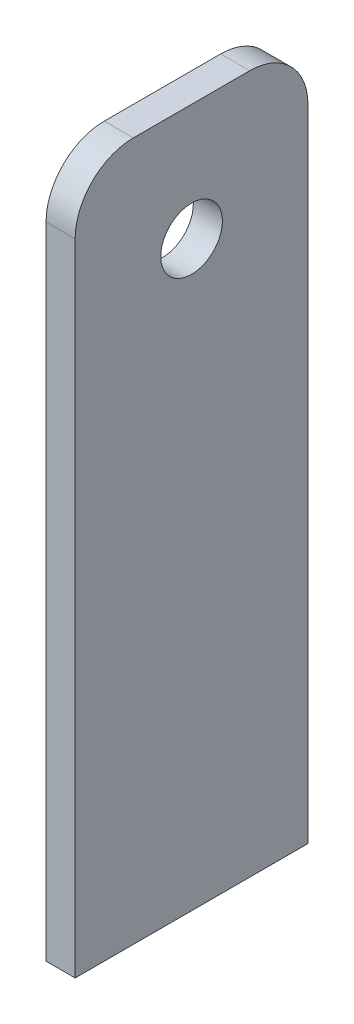
ISO-10303-21;
HEADER;
FILE_DESCRIPTION(('STEP AP214'),'2;1');
FILE_NAME('part.step','',(''),(''),'','','');
FILE_SCHEMA(('AUTOMOTIVE_DESIGN { 1 0 10303 214 1 1 1 1 }'));
ENDSEC;
DATA;
#1=APPLICATION_CONTEXT('core data for automotive mechanical design processes');
#2=APPLICATION_PROTOCOL_DEFINITION('international standard','automotive_design',2000,#1);
#3=PRODUCT_CONTEXT('',#1,'mechanical');
#4=PRODUCT('Part','Part','',(#3));
#5=PRODUCT_RELATED_PRODUCT_CATEGORY('part','',(#4));
#6=PRODUCT_DEFINITION_FORMATION('','',#4);
#7=PRODUCT_DEFINITION_CONTEXT('part definition',#1,'design');
#8=PRODUCT_DEFINITION('design','',#6,#7);
#9=PRODUCT_DEFINITION_SHAPE('','',#8);
#10=(LENGTH_UNIT() NAMED_UNIT(*) SI_UNIT(.MILLI.,.METRE.));
#11=(NAMED_UNIT(*) PLANE_ANGLE_UNIT() SI_UNIT($,.RADIAN.));
#12=(NAMED_UNIT(*) SI_UNIT($,.STERADIAN.) SOLID_ANGLE_UNIT());
#13=UNCERTAINTY_MEASURE_WITH_UNIT(LENGTH_MEASURE(1.E-05),#10,'distance_accuracy_value','');
#14=(GEOMETRIC_REPRESENTATION_CONTEXT(3) GLOBAL_UNCERTAINTY_ASSIGNED_CONTEXT((#13)) GLOBAL_UNIT_ASSIGNED_CONTEXT((#10,
#11,#12)) REPRESENTATION_CONTEXT('',''));
#15=CARTESIAN_POINT('',(0.,0.,0.));
#16=DIRECTION('',(0.,0.,1.));
#17=DIRECTION('',(1.,0.,0.));
#18=AXIS2_PLACEMENT_3D('',#15,#16,#17);
#19=CARTESIAN_POINT('',(0.,0.,0.));
#20=DIRECTION('',(1.,0.,0.));
#21=DIRECTION('',(0.,0.,-1.));
#22=AXIS2_PLACEMENT_3D('',#19,#20,#21);
#23=PLANE('',#22);
#24=CARTESIAN_POINT('',(0.,63.5,12.7));
#25=DIRECTION('',(1.,0.,0.));
#26=DIRECTION('',(0.,0.,-1.));
#27=AXIS2_PLACEMENT_3D('',#24,#25,#26);
#28=CIRCLE('',#27,3.3655);
#29=CARTESIAN_POINT('',(0.,63.5,9.3345));
#30=VERTEX_POINT('',#29);
#31=EDGE_CURVE('E85',#30,#30,#28,.T.);
#32=ORIENTED_EDGE('',*,*,#31,.T.);
#33=EDGE_LOOP('',(#32));
#34=FACE_BOUND('',#33,.T.);
#35=DIRECTION('',(0.,1.,0.));
#36=VECTOR('',#35,1.);
#37=CARTESIAN_POINT('',(0.,0.,0.));
#38=LINE('',#37,#36);
#39=CARTESIAN_POINT('',(0.,0.,0.));
#40=VERTEX_POINT('',#39);
#41=CARTESIAN_POINT('',(0.,69.85,0.));
#42=VERTEX_POINT('',#41);
#43=EDGE_CURVE('E69',#40,#42,#38,.T.);
#44=ORIENTED_EDGE('',*,*,#43,.F.);
#45=DIRECTION('',(0.,0.,-1.));
#46=VECTOR('',#45,1.);
#47=CARTESIAN_POINT('',(0.,0.,25.4));
#48=LINE('',#47,#46);
#49=CARTESIAN_POINT('',(0.,0.,25.4));
#50=VERTEX_POINT('',#49);
#51=EDGE_CURVE('E95',#50,#40,#48,.T.);
#52=ORIENTED_EDGE('',*,*,#51,.F.);
#53=DIRECTION('',(0.,1.,0.));
#54=VECTOR('',#53,1.);
#55=CARTESIAN_POINT('',(0.,76.2,25.4));
#56=LINE('',#55,#54);
#57=CARTESIAN_POINT('',(0.,69.85,25.4));
#58=VERTEX_POINT('',#57);
#59=EDGE_CURVE('E97',#58,#50,#56,.F.);
#60=ORIENTED_EDGE('',*,*,#59,.F.);
#61=CARTESIAN_POINT('',(0.,69.85,19.05));
#62=DIRECTION('',(-1.,0.,0.));
#63=DIRECTION('',(0.,0.,1.));
#64=AXIS2_PLACEMENT_3D('',#61,#62,#63);
#65=CIRCLE('',#64,6.35);
#66=CARTESIAN_POINT('',(0.,76.2,19.05));
#67=VERTEX_POINT('',#66);
#68=EDGE_CURVE('E105',#67,#58,#65,.F.);
#69=ORIENTED_EDGE('',*,*,#68,.F.);
#70=DIRECTION('',(0.,0.,1.));
#71=VECTOR('',#70,1.);
#72=CARTESIAN_POINT('',(0.,76.2,0.));
#73=LINE('',#72,#71);
#74=CARTESIAN_POINT('',(0.,76.2,6.35));
#75=VERTEX_POINT('',#74);
#76=EDGE_CURVE('E71',#75,#67,#73,.T.);
#77=ORIENTED_EDGE('',*,*,#76,.F.);
#78=CARTESIAN_POINT('',(0.,69.85,6.35));
#79=DIRECTION('',(-1.,0.,0.));
#80=DIRECTION('',(0.,0.,1.));
#81=AXIS2_PLACEMENT_3D('',#78,#79,#80);
#82=CIRCLE('',#81,6.35);
#83=EDGE_CURVE('E19',#42,#75,#82,.F.);
#84=ORIENTED_EDGE('',*,*,#83,.F.);
#85=EDGE_LOOP('',(#44,#52,#60,#69,#77,#84));
#86=FACE_BOUND('',#85,.T.);
#87=ADVANCED_FACE('F16',(#34,#86),#23,.F.);
#88=CARTESIAN_POINT('',(11.13155,69.85,6.35));
#89=DIRECTION('',(-1.,0.,0.));
#90=DIRECTION('',(0.,0.,1.));
#91=AXIS2_PLACEMENT_3D('',#88,#89,#90);
#92=CYLINDRICAL_SURFACE('',#91,6.35);
#93=CARTESIAN_POINT('',(3.175,69.85,6.35));
#94=DIRECTION('',(-1.,0.,0.));
#95=DIRECTION('',(0.,0.,1.));
#96=AXIS2_PLACEMENT_3D('',#93,#94,#95);
#97=CIRCLE('',#96,6.35);
#98=CARTESIAN_POINT('',(3.175,69.85,0.));
#99=VERTEX_POINT('',#98);
#100=CARTESIAN_POINT('',(3.175,76.2,6.35));
#101=VERTEX_POINT('',#100);
#102=EDGE_CURVE('E79',#99,#101,#97,.F.);
#103=ORIENTED_EDGE('',*,*,#102,.F.);
#104=DIRECTION('',(-1.,0.,0.));
#105=VECTOR('',#104,1.);
#106=CARTESIAN_POINT('',(0.,69.85,0.));
#107=LINE('',#106,#105);
#108=EDGE_CURVE('E76',#42,#99,#107,.F.);
#109=ORIENTED_EDGE('',*,*,#108,.F.);
#110=ORIENTED_EDGE('',*,*,#83,.T.);
#111=DIRECTION('',(1.,0.,0.));
#112=VECTOR('',#111,1.);
#113=CARTESIAN_POINT('',(0.,76.2,6.35));
#114=LINE('',#113,#112);
#115=EDGE_CURVE('E74',#101,#75,#114,.F.);
#116=ORIENTED_EDGE('',*,*,#115,.F.);
#117=EDGE_LOOP('',(#103,#109,#110,#116));
#118=FACE_BOUND('',#117,.T.);
#119=ADVANCED_FACE('F77',(#118),#92,.T.);
#120=CARTESIAN_POINT('',(0.,76.2,0.));
#121=DIRECTION('',(0.,1.,0.));
#122=DIRECTION('',(0.,0.,1.));
#123=AXIS2_PLACEMENT_3D('',#120,#121,#122);
#124=PLANE('',#123);
#125=DIRECTION('',(-1.,0.,0.));
#126=VECTOR('',#125,1.);
#127=CARTESIAN_POINT('',(11.13155,76.2,19.05));
#128=LINE('',#127,#126);
#129=CARTESIAN_POINT('',(3.175,76.2,19.05));
#130=VERTEX_POINT('',#129);
#131=EDGE_CURVE('E112',#130,#67,#128,.T.);
#132=ORIENTED_EDGE('',*,*,#131,.F.);
#133=DIRECTION('',(0.,0.,-1.));
#134=VECTOR('',#133,1.);
#135=CARTESIAN_POINT('',(3.175,76.2,0.));
#136=LINE('',#135,#134);
#137=EDGE_CURVE('E111',#101,#130,#136,.F.);
#138=ORIENTED_EDGE('',*,*,#137,.F.);
#139=ORIENTED_EDGE('',*,*,#115,.T.);
#140=ORIENTED_EDGE('',*,*,#76,.T.);
#141=EDGE_LOOP('',(#132,#138,#139,#140));
#142=FACE_BOUND('',#141,.T.);
#143=ADVANCED_FACE('F146',(#142),#124,.T.);
#144=CARTESIAN_POINT('',(11.13155,69.85,19.05));
#145=DIRECTION('',(-1.,0.,0.));
#146=DIRECTION('',(0.,0.,1.));
#147=AXIS2_PLACEMENT_3D('',#144,#145,#146);
#148=CYLINDRICAL_SURFACE('',#147,6.35);
#149=CARTESIAN_POINT('',(3.175,69.85,19.05));
#150=DIRECTION('',(-1.,0.,0.));
#151=DIRECTION('',(0.,0.,1.));
#152=AXIS2_PLACEMENT_3D('',#149,#150,#151);
#153=CIRCLE('',#152,6.35);
#154=CARTESIAN_POINT('',(3.175,69.85,25.4));
#155=VERTEX_POINT('',#154);
#156=EDGE_CURVE('E107',#130,#155,#153,.F.);
#157=ORIENTED_EDGE('',*,*,#156,.F.);
#158=ORIENTED_EDGE('',*,*,#131,.T.);
#159=ORIENTED_EDGE('',*,*,#68,.T.);
#160=DIRECTION('',(1.,0.,0.));
#161=VECTOR('',#160,1.);
#162=CARTESIAN_POINT('',(0.,69.85,25.4));
#163=LINE('',#162,#161);
#164=EDGE_CURVE('E102',#155,#58,#163,.F.);
#165=ORIENTED_EDGE('',*,*,#164,.F.);
#166=EDGE_LOOP('',(#157,#158,#159,#165));
#167=FACE_BOUND('',#166,.T.);
#168=ADVANCED_FACE('F148',(#167),#148,.T.);
#169=CARTESIAN_POINT('',(0.,76.2,25.4));
#170=DIRECTION('',(0.,0.,1.));
#171=DIRECTION('',(1.,0.,0.));
#172=AXIS2_PLACEMENT_3D('',#169,#170,#171);
#173=PLANE('',#172);
#174=DIRECTION('',(1.,0.,0.));
#175=VECTOR('',#174,1.);
#176=CARTESIAN_POINT('',(0.,0.,25.4));
#177=LINE('',#176,#175);
#178=CARTESIAN_POINT('',(3.175,0.,25.4));
#179=VERTEX_POINT('',#178);
#180=EDGE_CURVE('E82',#179,#50,#177,.F.);
#181=ORIENTED_EDGE('',*,*,#180,.F.);
#182=DIRECTION('',(0.,1.,0.));
#183=VECTOR('',#182,1.);
#184=CARTESIAN_POINT('',(3.175,0.,25.4));
#185=LINE('',#184,#183);
#186=EDGE_CURVE('E110',#155,#179,#185,.F.);
#187=ORIENTED_EDGE('',*,*,#186,.F.);
#188=ORIENTED_EDGE('',*,*,#164,.T.);
#189=ORIENTED_EDGE('',*,*,#59,.T.);
#190=EDGE_LOOP('',(#181,#187,#188,#189));
#191=FACE_BOUND('',#190,.T.);
#192=ADVANCED_FACE('F144',(#191),#173,.T.);
#193=CARTESIAN_POINT('',(0.,0.,25.4));
#194=DIRECTION('',(0.,-1.,0.));
#195=DIRECTION('',(0.,0.,-1.));
#196=AXIS2_PLACEMENT_3D('',#193,#194,#195);
#197=PLANE('',#196);
#198=DIRECTION('',(0.,0.,-1.));
#199=VECTOR('',#198,1.);
#200=CARTESIAN_POINT('',(3.175,0.,0.));
#201=LINE('',#200,#199);
#202=CARTESIAN_POINT('',(3.175,0.,0.));
#203=VERTEX_POINT('',#202);
#204=EDGE_CURVE('E126',#179,#203,#201,.T.);
#205=ORIENTED_EDGE('',*,*,#204,.F.);
#206=ORIENTED_EDGE('',*,*,#180,.T.);
#207=ORIENTED_EDGE('',*,*,#51,.T.);
#208=DIRECTION('',(-1.,0.,0.));
#209=VECTOR('',#208,1.);
#210=CARTESIAN_POINT('',(0.,0.,0.));
#211=LINE('',#210,#209);
#212=EDGE_CURVE('E34',#203,#40,#211,.T.);
#213=ORIENTED_EDGE('',*,*,#212,.F.);
#214=EDGE_LOOP('',(#205,#206,#207,#213));
#215=FACE_BOUND('',#214,.T.);
#216=ADVANCED_FACE('F142',(#215),#197,.T.);
#217=CARTESIAN_POINT('',(0.,0.,0.));
#218=DIRECTION('',(0.,0.,-1.));
#219=DIRECTION('',(-1.,0.,0.));
#220=AXIS2_PLACEMENT_3D('',#217,#218,#219);
#221=PLANE('',#220);
#222=ORIENTED_EDGE('',*,*,#212,.T.);
#223=ORIENTED_EDGE('',*,*,#43,.T.);
#224=ORIENTED_EDGE('',*,*,#108,.T.);
#225=DIRECTION('',(0.,1.,0.));
#226=VECTOR('',#225,1.);
#227=CARTESIAN_POINT('',(3.175,0.,0.));
#228=LINE('',#227,#226);
#229=EDGE_CURVE('E25',#203,#99,#228,.T.);
#230=ORIENTED_EDGE('',*,*,#229,.F.);
#231=EDGE_LOOP('',(#222,#223,#224,#230));
#232=FACE_BOUND('',#231,.T.);
#233=ADVANCED_FACE('F84',(#232),#221,.T.);
#234=CARTESIAN_POINT('',(0.,63.5,12.7));
#235=DIRECTION('',(1.,0.,0.));
#236=DIRECTION('',(0.,0.,-1.));
#237=AXIS2_PLACEMENT_3D('',#234,#235,#236);
#238=CYLINDRICAL_SURFACE('',#237,3.3655);
#239=CARTESIAN_POINT('',(3.175,63.5,12.7));
#240=DIRECTION('',(1.,0.,0.));
#241=DIRECTION('',(0.,0.,-1.));
#242=AXIS2_PLACEMENT_3D('',#239,#240,#241);
#243=CIRCLE('',#242,3.3655);
#244=CARTESIAN_POINT('',(3.175,63.5,9.3345));
#245=VERTEX_POINT('',#244);
#246=EDGE_CURVE('E11',#245,#245,#243,.F.);
#247=ORIENTED_EDGE('',*,*,#246,.F.);
#248=EDGE_LOOP('',(#247));
#249=FACE_BOUND('',#248,.T.);
#250=ORIENTED_EDGE('',*,*,#31,.F.);
#251=EDGE_LOOP('',(#250));
#252=FACE_BOUND('',#251,.T.);
#253=ADVANCED_FACE('F159',(#249,#252),#238,.F.);
#254=CARTESIAN_POINT('',(3.175,0.,0.));
#255=DIRECTION('',(1.,0.,0.));
#256=DIRECTION('',(0.,0.,-1.));
#257=AXIS2_PLACEMENT_3D('',#254,#255,#256);
#258=PLANE('',#257);
#259=ORIENTED_EDGE('',*,*,#246,.T.);
#260=EDGE_LOOP('',(#259));
#261=FACE_BOUND('',#260,.T.);
#262=ORIENTED_EDGE('',*,*,#204,.T.);
#263=ORIENTED_EDGE('',*,*,#229,.T.);
#264=ORIENTED_EDGE('',*,*,#102,.T.);
#265=ORIENTED_EDGE('',*,*,#137,.T.);
#266=ORIENTED_EDGE('',*,*,#156,.T.);
#267=ORIENTED_EDGE('',*,*,#186,.T.);
#268=EDGE_LOOP('',(#262,#263,#264,#265,#266,#267));
#269=FACE_BOUND('',#268,.T.);
#270=ADVANCED_FACE('F140',(#261,#269),#258,.T.);
#271=CLOSED_SHELL('',(#87,#119,#143,#168,#192,#216,#233,#253,#270));
#272=MANIFOLD_SOLID_BREP('B1',#271);
#273=ADVANCED_BREP_SHAPE_REPRESENTATION('',(#18,#272),#14);
#274=SHAPE_DEFINITION_REPRESENTATION(#9,#273);
ENDSEC;
END-ISO-10303-21;
